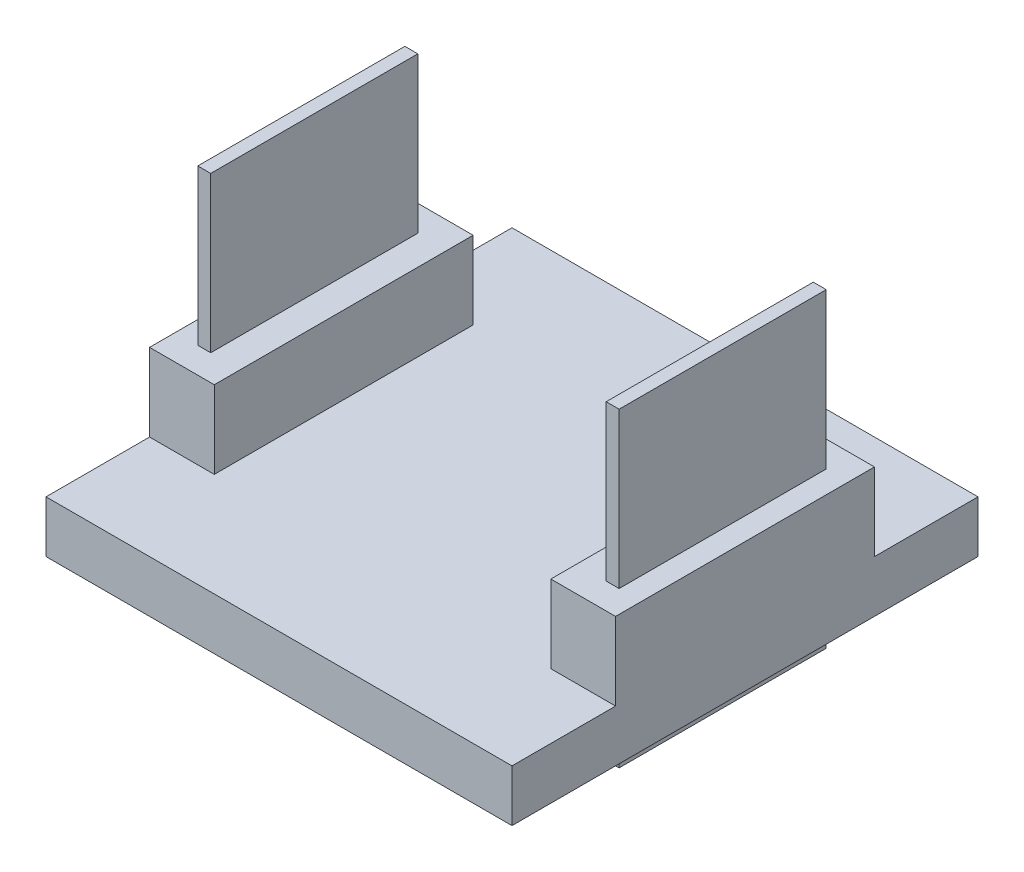
ISO-10303-21;
HEADER;
FILE_DESCRIPTION(('STEP AP214'),'2;1');
FILE_NAME('part.step','',(''),(''),'','','');
FILE_SCHEMA(('AUTOMOTIVE_DESIGN { 1 0 10303 214 1 1 1 1 }'));
ENDSEC;
DATA;
#1=APPLICATION_CONTEXT('core data for automotive mechanical design processes');
#2=APPLICATION_PROTOCOL_DEFINITION('international standard','automotive_design',2000,#1);
#3=PRODUCT_CONTEXT('',#1,'mechanical');
#4=PRODUCT('Part','Part','',(#3));
#5=PRODUCT_RELATED_PRODUCT_CATEGORY('part','',(#4));
#6=PRODUCT_DEFINITION_FORMATION('','',#4);
#7=PRODUCT_DEFINITION_CONTEXT('part definition',#1,'design');
#8=PRODUCT_DEFINITION('design','',#6,#7);
#9=PRODUCT_DEFINITION_SHAPE('','',#8);
#10=(LENGTH_UNIT() NAMED_UNIT(*) SI_UNIT(.MILLI.,.METRE.));
#11=(NAMED_UNIT(*) PLANE_ANGLE_UNIT() SI_UNIT($,.RADIAN.));
#12=(NAMED_UNIT(*) SI_UNIT($,.STERADIAN.) SOLID_ANGLE_UNIT());
#13=UNCERTAINTY_MEASURE_WITH_UNIT(LENGTH_MEASURE(1.E-05),#10,'distance_accuracy_value','');
#14=(GEOMETRIC_REPRESENTATION_CONTEXT(3) GLOBAL_UNCERTAINTY_ASSIGNED_CONTEXT((#13)) GLOBAL_UNIT_ASSIGNED_CONTEXT((#10,
#11,#12)) REPRESENTATION_CONTEXT('',''));
#15=CARTESIAN_POINT('',(0.,0.,0.));
#16=DIRECTION('',(0.,0.,1.));
#17=DIRECTION('',(1.,0.,0.));
#18=AXIS2_PLACEMENT_3D('',#15,#16,#17);
#19=CARTESIAN_POINT('',(0.,2.,0.));
#20=DIRECTION('',(0.,-1.,0.));
#21=DIRECTION('',(0.,0.,-1.));
#22=AXIS2_PLACEMENT_3D('',#19,#20,#21);
#23=PLANE('',#22);
#24=DIRECTION('',(-1.,0.,0.));
#25=VECTOR('',#24,1.);
#26=CARTESIAN_POINT('',(9.,2.,-4.99999999999999));
#27=LINE('',#26,#25);
#28=CARTESIAN_POINT('',(9.,2.,-4.99999999999999));
#29=VERTEX_POINT('',#28);
#30=CARTESIAN_POINT('',(6.5,2.,-5.));
#31=VERTEX_POINT('',#30);
#32=EDGE_CURVE('E327',#29,#31,#27,.T.);
#33=ORIENTED_EDGE('',*,*,#32,.F.);
#34=DIRECTION('',(0.,0.,-1.));
#35=VECTOR('',#34,1.);
#36=CARTESIAN_POINT('',(9.,2.,9.));
#37=LINE('',#36,#35);
#38=CARTESIAN_POINT('',(9.,2.,-9.));
#39=VERTEX_POINT('',#38);
#40=EDGE_CURVE('E391',#29,#39,#37,.T.);
#41=ORIENTED_EDGE('',*,*,#40,.T.);
#42=DIRECTION('',(-1.,0.,0.));
#43=VECTOR('',#42,1.);
#44=CARTESIAN_POINT('',(-9.,2.,-9.));
#45=LINE('',#44,#43);
#46=CARTESIAN_POINT('',(-9.,2.,-9.));
#47=VERTEX_POINT('',#46);
#48=EDGE_CURVE('E390',#39,#47,#45,.T.);
#49=ORIENTED_EDGE('',*,*,#48,.T.);
#50=DIRECTION('',(0.,0.,1.));
#51=VECTOR('',#50,1.);
#52=CARTESIAN_POINT('',(-9.,2.,9.));
#53=LINE('',#52,#51);
#54=CARTESIAN_POINT('',(-9.,2.,-5.));
#55=VERTEX_POINT('',#54);
#56=EDGE_CURVE('E394',#47,#55,#53,.T.);
#57=ORIENTED_EDGE('',*,*,#56,.T.);
#58=DIRECTION('',(-1.,0.,0.));
#59=VECTOR('',#58,1.);
#60=CARTESIAN_POINT('',(-9.,2.,-4.99999999999999));
#61=LINE('',#60,#59);
#62=CARTESIAN_POINT('',(-6.5,2.,-5.));
#63=VERTEX_POINT('',#62);
#64=EDGE_CURVE('E362',#63,#55,#61,.T.);
#65=ORIENTED_EDGE('',*,*,#64,.F.);
#66=DIRECTION('',(0.,0.,-1.));
#67=VECTOR('',#66,1.);
#68=CARTESIAN_POINT('',(-6.5,2.,5.));
#69=LINE('',#68,#67);
#70=CARTESIAN_POINT('',(-6.5,2.,5.));
#71=VERTEX_POINT('',#70);
#72=EDGE_CURVE('E371',#71,#63,#69,.T.);
#73=ORIENTED_EDGE('',*,*,#72,.F.);
#74=DIRECTION('',(1.,0.,0.));
#75=VECTOR('',#74,1.);
#76=CARTESIAN_POINT('',(-9.,2.,5.));
#77=LINE('',#76,#75);
#78=CARTESIAN_POINT('',(-9.,2.,5.));
#79=VERTEX_POINT('',#78);
#80=EDGE_CURVE('E357',#79,#71,#77,.T.);
#81=ORIENTED_EDGE('',*,*,#80,.F.);
#82=CARTESIAN_POINT('',(-9.,2.,9.));
#83=VERTEX_POINT('',#82);
#84=EDGE_CURVE('E393',#79,#83,#53,.T.);
#85=ORIENTED_EDGE('',*,*,#84,.T.);
#86=DIRECTION('',(1.,0.,0.));
#87=VECTOR('',#86,1.);
#88=CARTESIAN_POINT('',(-9.,2.,9.));
#89=LINE('',#88,#87);
#90=CARTESIAN_POINT('',(9.,2.,9.));
#91=VERTEX_POINT('',#90);
#92=EDGE_CURVE('E396',#83,#91,#89,.T.);
#93=ORIENTED_EDGE('',*,*,#92,.T.);
#94=CARTESIAN_POINT('',(9.,2.,5.));
#95=VERTEX_POINT('',#94);
#96=EDGE_CURVE('E388',#91,#95,#37,.T.);
#97=ORIENTED_EDGE('',*,*,#96,.T.);
#98=DIRECTION('',(1.,0.,0.));
#99=VECTOR('',#98,1.);
#100=CARTESIAN_POINT('',(9.,2.,5.));
#101=LINE('',#100,#99);
#102=CARTESIAN_POINT('',(6.5,2.,5.));
#103=VERTEX_POINT('',#102);
#104=EDGE_CURVE('E332',#103,#95,#101,.T.);
#105=ORIENTED_EDGE('',*,*,#104,.F.);
#106=DIRECTION('',(0.,0.,1.));
#107=VECTOR('',#106,1.);
#108=CARTESIAN_POINT('',(6.5,2.,5.));
#109=LINE('',#108,#107);
#110=EDGE_CURVE('E341',#31,#103,#109,.T.);
#111=ORIENTED_EDGE('',*,*,#110,.F.);
#112=EDGE_LOOP('',(#33,#41,#49,#57,#65,#73,#81,#85,#93,#97,#105,#111));
#113=FACE_BOUND('',#112,.T.);
#114=ADVANCED_FACE('F33',(#113),#23,.F.);
#115=CARTESIAN_POINT('',(9.,2.,9.));
#116=DIRECTION('',(-1.,0.,0.));
#117=DIRECTION('',(0.,0.,1.));
#118=AXIS2_PLACEMENT_3D('',#115,#116,#117);
#119=PLANE('',#118);
#120=DIRECTION('',(0.,0.,-1.));
#121=VECTOR('',#120,1.);
#122=CARTESIAN_POINT('',(9.,0.,9.));
#123=LINE('',#122,#121);
#124=CARTESIAN_POINT('',(9.,0.,9.));
#125=VERTEX_POINT('',#124);
#126=CARTESIAN_POINT('',(9.,0.,-9.));
#127=VERTEX_POINT('',#126);
#128=EDGE_CURVE('E387',#125,#127,#123,.T.);
#129=ORIENTED_EDGE('',*,*,#128,.T.);
#130=DIRECTION('',(0.,-1.,0.));
#131=VECTOR('',#130,1.);
#132=CARTESIAN_POINT('',(9.,2.,-9.));
#133=LINE('',#132,#131);
#134=EDGE_CURVE('E415',#39,#127,#133,.T.);
#135=ORIENTED_EDGE('',*,*,#134,.F.);
#136=ORIENTED_EDGE('',*,*,#40,.F.);
#137=DIRECTION('',(0.,-1.,0.));
#138=VECTOR('',#137,1.);
#139=CARTESIAN_POINT('',(9.,5.,-4.99999999999999));
#140=LINE('',#139,#138);
#141=CARTESIAN_POINT('',(9.,5.,-4.99999999999999));
#142=VERTEX_POINT('',#141);
#143=EDGE_CURVE('E354',#142,#29,#140,.T.);
#144=ORIENTED_EDGE('',*,*,#143,.F.);
#145=DIRECTION('',(0.,0.,-1.));
#146=VECTOR('',#145,1.);
#147=CARTESIAN_POINT('',(9.,5.,5.));
#148=LINE('',#147,#146);
#149=CARTESIAN_POINT('',(9.,5.,5.));
#150=VERTEX_POINT('',#149);
#151=EDGE_CURVE('E328',#150,#142,#148,.T.);
#152=ORIENTED_EDGE('',*,*,#151,.F.);
#153=DIRECTION('',(0.,-1.,0.));
#154=VECTOR('',#153,1.);
#155=CARTESIAN_POINT('',(9.,5.,5.));
#156=LINE('',#155,#154);
#157=EDGE_CURVE('E338',#150,#95,#156,.T.);
#158=ORIENTED_EDGE('',*,*,#157,.T.);
#159=ORIENTED_EDGE('',*,*,#96,.F.);
#160=DIRECTION('',(0.,-1.,0.));
#161=VECTOR('',#160,1.);
#162=CARTESIAN_POINT('',(9.,2.,9.));
#163=LINE('',#162,#161);
#164=EDGE_CURVE('E398',#91,#125,#163,.T.);
#165=ORIENTED_EDGE('',*,*,#164,.T.);
#166=EDGE_LOOP('',(#129,#135,#136,#144,#152,#158,#159,#165));
#167=FACE_BOUND('',#166,.T.);
#168=ADVANCED_FACE('F35',(#167),#119,.F.);
#169=CARTESIAN_POINT('',(-9.,2.,-9.));
#170=DIRECTION('',(0.,0.,1.));
#171=DIRECTION('',(1.,0.,0.));
#172=AXIS2_PLACEMENT_3D('',#169,#170,#171);
#173=PLANE('',#172);
#174=DIRECTION('',(-1.,0.,0.));
#175=VECTOR('',#174,1.);
#176=CARTESIAN_POINT('',(-9.,0.,-9.));
#177=LINE('',#176,#175);
#178=CARTESIAN_POINT('',(-9.,0.,-9.));
#179=VERTEX_POINT('',#178);
#180=EDGE_CURVE('E401',#127,#179,#177,.T.);
#181=ORIENTED_EDGE('',*,*,#180,.T.);
#182=DIRECTION('',(0.,-1.,0.));
#183=VECTOR('',#182,1.);
#184=CARTESIAN_POINT('',(-9.,2.,-9.));
#185=LINE('',#184,#183);
#186=EDGE_CURVE('E412',#47,#179,#185,.T.);
#187=ORIENTED_EDGE('',*,*,#186,.F.);
#188=ORIENTED_EDGE('',*,*,#48,.F.);
#189=ORIENTED_EDGE('',*,*,#134,.T.);
#190=EDGE_LOOP('',(#181,#187,#188,#189));
#191=FACE_BOUND('',#190,.T.);
#192=ADVANCED_FACE('F462',(#191),#173,.F.);
#193=CARTESIAN_POINT('',(-9.,2.,9.));
#194=DIRECTION('',(1.,0.,0.));
#195=DIRECTION('',(0.,0.,-1.));
#196=AXIS2_PLACEMENT_3D('',#193,#194,#195);
#197=PLANE('',#196);
#198=DIRECTION('',(0.,0.,1.));
#199=VECTOR('',#198,1.);
#200=CARTESIAN_POINT('',(-9.,0.,9.));
#201=LINE('',#200,#199);
#202=CARTESIAN_POINT('',(-9.,0.,9.));
#203=VERTEX_POINT('',#202);
#204=EDGE_CURVE('E403',#179,#203,#201,.T.);
#205=ORIENTED_EDGE('',*,*,#204,.T.);
#206=DIRECTION('',(0.,-1.,0.));
#207=VECTOR('',#206,1.);
#208=CARTESIAN_POINT('',(-9.,2.,9.));
#209=LINE('',#208,#207);
#210=EDGE_CURVE('E409',#83,#203,#209,.T.);
#211=ORIENTED_EDGE('',*,*,#210,.F.);
#212=ORIENTED_EDGE('',*,*,#84,.F.);
#213=DIRECTION('',(0.,-1.,0.));
#214=VECTOR('',#213,1.);
#215=CARTESIAN_POINT('',(-9.,5.,5.));
#216=LINE('',#215,#214);
#217=CARTESIAN_POINT('',(-9.,5.,5.));
#218=VERTEX_POINT('',#217);
#219=EDGE_CURVE('E384',#218,#79,#216,.T.);
#220=ORIENTED_EDGE('',*,*,#219,.F.);
#221=DIRECTION('',(0.,0.,1.));
#222=VECTOR('',#221,1.);
#223=CARTESIAN_POINT('',(-9.,5.,5.));
#224=LINE('',#223,#222);
#225=CARTESIAN_POINT('',(-9.,5.,-4.99999999999999));
#226=VERTEX_POINT('',#225);
#227=EDGE_CURVE('E358',#226,#218,#224,.T.);
#228=ORIENTED_EDGE('',*,*,#227,.F.);
#229=DIRECTION('',(0.,-1.,0.));
#230=VECTOR('',#229,1.);
#231=CARTESIAN_POINT('',(-9.,5.,-4.99999999999999));
#232=LINE('',#231,#230);
#233=EDGE_CURVE('E368',#226,#55,#232,.T.);
#234=ORIENTED_EDGE('',*,*,#233,.T.);
#235=ORIENTED_EDGE('',*,*,#56,.F.);
#236=ORIENTED_EDGE('',*,*,#186,.T.);
#237=EDGE_LOOP('',(#205,#211,#212,#220,#228,#234,#235,#236));
#238=FACE_BOUND('',#237,.T.);
#239=ADVANCED_FACE('F475',(#238),#197,.F.);
#240=CARTESIAN_POINT('',(-9.,2.,9.));
#241=DIRECTION('',(0.,0.,-1.));
#242=DIRECTION('',(-1.,0.,0.));
#243=AXIS2_PLACEMENT_3D('',#240,#241,#242);
#244=PLANE('',#243);
#245=DIRECTION('',(1.,0.,0.));
#246=VECTOR('',#245,1.);
#247=CARTESIAN_POINT('',(-9.,0.,9.));
#248=LINE('',#247,#246);
#249=EDGE_CURVE('E405',#203,#125,#248,.T.);
#250=ORIENTED_EDGE('',*,*,#249,.T.);
#251=ORIENTED_EDGE('',*,*,#164,.F.);
#252=ORIENTED_EDGE('',*,*,#92,.F.);
#253=ORIENTED_EDGE('',*,*,#210,.T.);
#254=EDGE_LOOP('',(#250,#251,#252,#253));
#255=FACE_BOUND('',#254,.T.);
#256=ADVANCED_FACE('F472',(#255),#244,.F.);
#257=CARTESIAN_POINT('',(0.,0.,0.));
#258=DIRECTION('',(0.,-1.,0.));
#259=DIRECTION('',(0.,0.,-1.));
#260=AXIS2_PLACEMENT_3D('',#257,#258,#259);
#261=PLANE('',#260);
#262=DIRECTION('',(0.,0.,1.));
#263=VECTOR('',#262,1.);
#264=CARTESIAN_POINT('',(8.13755561268732,0.,0.));
#265=LINE('',#264,#263);
#266=CARTESIAN_POINT('',(8.13755561268732,0.,-3.99999999999999));
#267=VERTEX_POINT('',#266);
#268=CARTESIAN_POINT('',(8.13755561268732,0.,4.00000000000001));
#269=VERTEX_POINT('',#268);
#270=EDGE_CURVE('E273',#267,#269,#265,.T.);
#271=ORIENTED_EDGE('',*,*,#270,.F.);
#272=DIRECTION('',(1.,0.,0.));
#273=VECTOR('',#272,1.);
#274=CARTESIAN_POINT('',(0.,0.,-3.99999999999999));
#275=LINE('',#274,#273);
#276=CARTESIAN_POINT('',(7.63755561268732,0.,-3.99999999999999));
#277=VERTEX_POINT('',#276);
#278=EDGE_CURVE('E259',#277,#267,#275,.T.);
#279=ORIENTED_EDGE('',*,*,#278,.F.);
#280=DIRECTION('',(0.,0.,-1.));
#281=VECTOR('',#280,1.);
#282=CARTESIAN_POINT('',(7.63755561268732,0.,0.));
#283=LINE('',#282,#281);
#284=CARTESIAN_POINT('',(7.63755561268732,0.,4.00000000000001));
#285=VERTEX_POINT('',#284);
#286=EDGE_CURVE('E53',#285,#277,#283,.T.);
#287=ORIENTED_EDGE('',*,*,#286,.F.);
#288=DIRECTION('',(-1.,0.,0.));
#289=VECTOR('',#288,1.);
#290=CARTESIAN_POINT('',(0.,0.,4.00000000000001));
#291=LINE('',#290,#289);
#292=EDGE_CURVE('E48',#269,#285,#291,.T.);
#293=ORIENTED_EDGE('',*,*,#292,.F.);
#294=EDGE_LOOP('',(#271,#279,#287,#293));
#295=FACE_BOUND('',#294,.T.);
#296=DIRECTION('',(0.,0.,1.));
#297=VECTOR('',#296,1.);
#298=CARTESIAN_POINT('',(-7.63755561268731,0.,0.));
#299=LINE('',#298,#297);
#300=CARTESIAN_POINT('',(-7.63755561268731,0.,-3.99999999999999));
#301=VERTEX_POINT('',#300);
#302=CARTESIAN_POINT('',(-7.63755561268731,0.,4.00000000000001));
#303=VERTEX_POINT('',#302);
#304=EDGE_CURVE('E324',#301,#303,#299,.T.);
#305=ORIENTED_EDGE('',*,*,#304,.F.);
#306=DIRECTION('',(1.,0.,0.));
#307=VECTOR('',#306,1.);
#308=CARTESIAN_POINT('',(0.,0.,-3.99999999999999));
#309=LINE('',#308,#307);
#310=CARTESIAN_POINT('',(-8.13755561268731,0.,-3.99999999999999));
#311=VERTEX_POINT('',#310);
#312=EDGE_CURVE('E303',#311,#301,#309,.T.);
#313=ORIENTED_EDGE('',*,*,#312,.F.);
#314=DIRECTION('',(0.,0.,-1.));
#315=VECTOR('',#314,1.);
#316=CARTESIAN_POINT('',(-8.13755561268731,0.,0.));
#317=LINE('',#316,#315);
#318=CARTESIAN_POINT('',(-8.13755561268731,0.,4.00000000000001));
#319=VERTEX_POINT('',#318);
#320=EDGE_CURVE('E318',#319,#311,#317,.T.);
#321=ORIENTED_EDGE('',*,*,#320,.F.);
#322=DIRECTION('',(-1.,0.,0.));
#323=VECTOR('',#322,1.);
#324=CARTESIAN_POINT('',(0.,0.,4.00000000000001));
#325=LINE('',#324,#323);
#326=EDGE_CURVE('E321',#303,#319,#325,.T.);
#327=ORIENTED_EDGE('',*,*,#326,.F.);
#328=EDGE_LOOP('',(#305,#313,#321,#327));
#329=FACE_BOUND('',#328,.T.);
#330=ORIENTED_EDGE('',*,*,#128,.F.);
#331=ORIENTED_EDGE('',*,*,#249,.F.);
#332=ORIENTED_EDGE('',*,*,#204,.F.);
#333=ORIENTED_EDGE('',*,*,#180,.F.);
#334=EDGE_LOOP('',(#330,#331,#332,#333));
#335=FACE_BOUND('',#334,.T.);
#336=ADVANCED_FACE('F469',(#295,#329,#335),#261,.T.);
#337=CARTESIAN_POINT('',(-9.,5.,5.));
#338=DIRECTION('',(0.,0.,-1.));
#339=DIRECTION('',(-1.,0.,0.));
#340=AXIS2_PLACEMENT_3D('',#337,#338,#339);
#341=PLANE('',#340);
#342=ORIENTED_EDGE('',*,*,#80,.T.);
#343=DIRECTION('',(0.,-1.,0.));
#344=VECTOR('',#343,1.);
#345=CARTESIAN_POINT('',(-6.5,5.,5.));
#346=LINE('',#345,#344);
#347=CARTESIAN_POINT('',(-6.5,5.,5.));
#348=VERTEX_POINT('',#347);
#349=EDGE_CURVE('E381',#348,#71,#346,.T.);
#350=ORIENTED_EDGE('',*,*,#349,.F.);
#351=DIRECTION('',(1.,0.,0.));
#352=VECTOR('',#351,1.);
#353=CARTESIAN_POINT('',(-9.,5.,5.));
#354=LINE('',#353,#352);
#355=EDGE_CURVE('E361',#218,#348,#354,.T.);
#356=ORIENTED_EDGE('',*,*,#355,.F.);
#357=ORIENTED_EDGE('',*,*,#219,.T.);
#358=EDGE_LOOP('',(#342,#350,#356,#357));
#359=FACE_BOUND('',#358,.T.);
#360=ADVANCED_FACE('F467',(#359),#341,.F.);
#361=CARTESIAN_POINT('',(-6.5,5.,5.));
#362=DIRECTION('',(-1.,0.,0.));
#363=DIRECTION('',(0.,0.,1.));
#364=AXIS2_PLACEMENT_3D('',#361,#362,#363);
#365=PLANE('',#364);
#366=ORIENTED_EDGE('',*,*,#72,.T.);
#367=DIRECTION('',(0.,-1.,0.));
#368=VECTOR('',#367,1.);
#369=CARTESIAN_POINT('',(-6.5,5.,-5.));
#370=LINE('',#369,#368);
#371=CARTESIAN_POINT('',(-6.5,5.,-5.));
#372=VERTEX_POINT('',#371);
#373=EDGE_CURVE('E378',#372,#63,#370,.T.);
#374=ORIENTED_EDGE('',*,*,#373,.F.);
#375=DIRECTION('',(0.,0.,-1.));
#376=VECTOR('',#375,1.);
#377=CARTESIAN_POINT('',(-6.5,5.,5.));
#378=LINE('',#377,#376);
#379=EDGE_CURVE('E364',#348,#372,#378,.T.);
#380=ORIENTED_EDGE('',*,*,#379,.F.);
#381=ORIENTED_EDGE('',*,*,#349,.T.);
#382=EDGE_LOOP('',(#366,#374,#380,#381));
#383=FACE_BOUND('',#382,.T.);
#384=ADVANCED_FACE('F521',(#383),#365,.F.);
#385=CARTESIAN_POINT('',(-9.,5.,-4.99999999999999));
#386=DIRECTION('',(0.,0.,1.));
#387=DIRECTION('',(1.,0.,0.));
#388=AXIS2_PLACEMENT_3D('',#385,#386,#387);
#389=PLANE('',#388);
#390=ORIENTED_EDGE('',*,*,#64,.T.);
#391=ORIENTED_EDGE('',*,*,#233,.F.);
#392=DIRECTION('',(-1.,0.,0.));
#393=VECTOR('',#392,1.);
#394=CARTESIAN_POINT('',(-9.,5.,-4.99999999999999));
#395=LINE('',#394,#393);
#396=EDGE_CURVE('E366',#372,#226,#395,.T.);
#397=ORIENTED_EDGE('',*,*,#396,.F.);
#398=ORIENTED_EDGE('',*,*,#373,.T.);
#399=EDGE_LOOP('',(#390,#391,#397,#398));
#400=FACE_BOUND('',#399,.T.);
#401=ADVANCED_FACE('F510',(#400),#389,.F.);
#402=CARTESIAN_POINT('',(0.,5.,0.));
#403=DIRECTION('',(0.,-1.,0.));
#404=DIRECTION('',(0.,0.,-1.));
#405=AXIS2_PLACEMENT_3D('',#402,#403,#404);
#406=PLANE('',#405);
#407=DIRECTION('',(1.,0.,0.));
#408=VECTOR('',#407,1.);
#409=CARTESIAN_POINT('',(0.,5.,-3.99999999999999));
#410=LINE('',#409,#408);
#411=CARTESIAN_POINT('',(-8.13755561268731,5.,-3.99999999999999));
#412=VERTEX_POINT('',#411);
#413=CARTESIAN_POINT('',(-7.63755561268731,5.,-3.99999999999999));
#414=VERTEX_POINT('',#413);
#415=EDGE_CURVE('E418',#412,#414,#410,.T.);
#416=ORIENTED_EDGE('',*,*,#415,.T.);
#417=DIRECTION('',(0.,0.,1.));
#418=VECTOR('',#417,1.);
#419=CARTESIAN_POINT('',(-7.63755561268731,5.,0.));
#420=LINE('',#419,#418);
#421=CARTESIAN_POINT('',(-7.63755561268731,5.,4.00000000000001));
#422=VERTEX_POINT('',#421);
#423=EDGE_CURVE('E427',#414,#422,#420,.T.);
#424=ORIENTED_EDGE('',*,*,#423,.T.);
#425=DIRECTION('',(-1.,0.,0.));
#426=VECTOR('',#425,1.);
#427=CARTESIAN_POINT('',(0.,5.,4.00000000000001));
#428=LINE('',#427,#426);
#429=CARTESIAN_POINT('',(-8.13755561268731,5.,4.00000000000001));
#430=VERTEX_POINT('',#429);
#431=EDGE_CURVE('E424',#422,#430,#428,.T.);
#432=ORIENTED_EDGE('',*,*,#431,.T.);
#433=DIRECTION('',(0.,0.,-1.));
#434=VECTOR('',#433,1.);
#435=CARTESIAN_POINT('',(-8.13755561268731,5.,0.));
#436=LINE('',#435,#434);
#437=EDGE_CURVE('E421',#430,#412,#436,.T.);
#438=ORIENTED_EDGE('',*,*,#437,.T.);
#439=EDGE_LOOP('',(#416,#424,#432,#438));
#440=FACE_BOUND('',#439,.T.);
#441=ORIENTED_EDGE('',*,*,#227,.T.);
#442=ORIENTED_EDGE('',*,*,#355,.T.);
#443=ORIENTED_EDGE('',*,*,#379,.T.);
#444=ORIENTED_EDGE('',*,*,#396,.T.);
#445=EDGE_LOOP('',(#441,#442,#443,#444));
#446=FACE_BOUND('',#445,.T.);
#447=ADVANCED_FACE('F517',(#440,#446),#406,.F.);
#448=CARTESIAN_POINT('',(9.,5.,-4.99999999999999));
#449=DIRECTION('',(0.,0.,1.));
#450=DIRECTION('',(1.,0.,0.));
#451=AXIS2_PLACEMENT_3D('',#448,#449,#450);
#452=PLANE('',#451);
#453=ORIENTED_EDGE('',*,*,#32,.T.);
#454=DIRECTION('',(0.,-1.,0.));
#455=VECTOR('',#454,1.);
#456=CARTESIAN_POINT('',(6.5,5.,-5.));
#457=LINE('',#456,#455);
#458=CARTESIAN_POINT('',(6.5,5.,-5.));
#459=VERTEX_POINT('',#458);
#460=EDGE_CURVE('E351',#459,#31,#457,.T.);
#461=ORIENTED_EDGE('',*,*,#460,.F.);
#462=DIRECTION('',(-1.,0.,0.));
#463=VECTOR('',#462,1.);
#464=CARTESIAN_POINT('',(9.,5.,-4.99999999999999));
#465=LINE('',#464,#463);
#466=EDGE_CURVE('E331',#142,#459,#465,.T.);
#467=ORIENTED_EDGE('',*,*,#466,.F.);
#468=ORIENTED_EDGE('',*,*,#143,.T.);
#469=EDGE_LOOP('',(#453,#461,#467,#468));
#470=FACE_BOUND('',#469,.T.);
#471=ADVANCED_FACE('F506',(#470),#452,.F.);
#472=CARTESIAN_POINT('',(6.5,5.,5.));
#473=DIRECTION('',(1.,0.,0.));
#474=DIRECTION('',(0.,0.,-1.));
#475=AXIS2_PLACEMENT_3D('',#472,#473,#474);
#476=PLANE('',#475);
#477=ORIENTED_EDGE('',*,*,#110,.T.);
#478=DIRECTION('',(0.,-1.,0.));
#479=VECTOR('',#478,1.);
#480=CARTESIAN_POINT('',(6.5,5.,5.));
#481=LINE('',#480,#479);
#482=CARTESIAN_POINT('',(6.5,5.,5.));
#483=VERTEX_POINT('',#482);
#484=EDGE_CURVE('E348',#483,#103,#481,.T.);
#485=ORIENTED_EDGE('',*,*,#484,.F.);
#486=DIRECTION('',(0.,0.,1.));
#487=VECTOR('',#486,1.);
#488=CARTESIAN_POINT('',(6.5,5.,5.));
#489=LINE('',#488,#487);
#490=EDGE_CURVE('E334',#459,#483,#489,.T.);
#491=ORIENTED_EDGE('',*,*,#490,.F.);
#492=ORIENTED_EDGE('',*,*,#460,.T.);
#493=EDGE_LOOP('',(#477,#485,#491,#492));
#494=FACE_BOUND('',#493,.T.);
#495=ADVANCED_FACE('F503',(#494),#476,.F.);
#496=CARTESIAN_POINT('',(9.,5.,5.));
#497=DIRECTION('',(0.,0.,-1.));
#498=DIRECTION('',(-1.,0.,0.));
#499=AXIS2_PLACEMENT_3D('',#496,#497,#498);
#500=PLANE('',#499);
#501=ORIENTED_EDGE('',*,*,#104,.T.);
#502=ORIENTED_EDGE('',*,*,#157,.F.);
#503=DIRECTION('',(1.,0.,0.));
#504=VECTOR('',#503,1.);
#505=CARTESIAN_POINT('',(9.,5.,5.));
#506=LINE('',#505,#504);
#507=EDGE_CURVE('E336',#483,#150,#506,.T.);
#508=ORIENTED_EDGE('',*,*,#507,.F.);
#509=ORIENTED_EDGE('',*,*,#484,.T.);
#510=EDGE_LOOP('',(#501,#502,#508,#509));
#511=FACE_BOUND('',#510,.T.);
#512=ADVANCED_FACE('F498',(#511),#500,.F.);
#513=CARTESIAN_POINT('',(0.,5.,0.));
#514=DIRECTION('',(0.,1.,0.));
#515=DIRECTION('',(0.,0.,1.));
#516=AXIS2_PLACEMENT_3D('',#513,#514,#515);
#517=PLANE('',#516);
#518=DIRECTION('',(0.,0.,-1.));
#519=VECTOR('',#518,1.);
#520=CARTESIAN_POINT('',(8.13755561268732,5.,0.));
#521=LINE('',#520,#519);
#522=CARTESIAN_POINT('',(8.13755561268732,5.,4.00000000000001));
#523=VERTEX_POINT('',#522);
#524=CARTESIAN_POINT('',(8.13755561268732,5.,-3.99999999999999));
#525=VERTEX_POINT('',#524);
#526=EDGE_CURVE('E11',#523,#525,#521,.T.);
#527=ORIENTED_EDGE('',*,*,#526,.F.);
#528=DIRECTION('',(1.,0.,0.));
#529=VECTOR('',#528,1.);
#530=CARTESIAN_POINT('',(0.,5.,4.00000000000001));
#531=LINE('',#530,#529);
#532=CARTESIAN_POINT('',(7.63755561268732,5.,4.00000000000001));
#533=VERTEX_POINT('',#532);
#534=EDGE_CURVE('E41',#533,#523,#531,.T.);
#535=ORIENTED_EDGE('',*,*,#534,.F.);
#536=DIRECTION('',(0.,0.,1.));
#537=VECTOR('',#536,1.);
#538=CARTESIAN_POINT('',(7.63755561268732,5.,0.));
#539=LINE('',#538,#537);
#540=CARTESIAN_POINT('',(7.63755561268732,5.,-3.99999999999999));
#541=VERTEX_POINT('',#540);
#542=EDGE_CURVE('E432',#541,#533,#539,.T.);
#543=ORIENTED_EDGE('',*,*,#542,.F.);
#544=DIRECTION('',(-1.,0.,0.));
#545=VECTOR('',#544,1.);
#546=CARTESIAN_POINT('',(0.,5.,-3.99999999999999));
#547=LINE('',#546,#545);
#548=EDGE_CURVE('E430',#525,#541,#547,.T.);
#549=ORIENTED_EDGE('',*,*,#548,.F.);
#550=EDGE_LOOP('',(#527,#535,#543,#549));
#551=FACE_BOUND('',#550,.T.);
#552=ORIENTED_EDGE('',*,*,#151,.T.);
#553=ORIENTED_EDGE('',*,*,#466,.T.);
#554=ORIENTED_EDGE('',*,*,#490,.T.);
#555=ORIENTED_EDGE('',*,*,#507,.T.);
#556=EDGE_LOOP('',(#552,#553,#554,#555));
#557=FACE_BOUND('',#556,.T.);
#558=ADVANCED_FACE('F439',(#551,#557),#517,.T.);
#559=CARTESIAN_POINT('',(0.,11.,0.));
#560=DIRECTION('',(0.,-1.,0.));
#561=DIRECTION('',(0.,0.,-1.));
#562=AXIS2_PLACEMENT_3D('',#559,#560,#561);
#563=PLANE('',#562);
#564=DIRECTION('',(0.,0.,-1.));
#565=VECTOR('',#564,1.);
#566=CARTESIAN_POINT('',(-7.63755561268731,11.,4.00000000000001));
#567=LINE('',#566,#565);
#568=CARTESIAN_POINT('',(-7.63755561268731,11.,4.00000000000001));
#569=VERTEX_POINT('',#568);
#570=CARTESIAN_POINT('',(-7.63755561268731,11.,-3.99999999999999));
#571=VERTEX_POINT('',#570);
#572=EDGE_CURVE('E275',#569,#571,#567,.T.);
#573=ORIENTED_EDGE('',*,*,#572,.T.);
#574=DIRECTION('',(-1.,0.,0.));
#575=VECTOR('',#574,1.);
#576=CARTESIAN_POINT('',(-8.13755561268731,11.,-3.99999999999999));
#577=LINE('',#576,#575);
#578=CARTESIAN_POINT('',(-8.13755561268731,11.,-3.99999999999999));
#579=VERTEX_POINT('',#578);
#580=EDGE_CURVE('E278',#571,#579,#577,.T.);
#581=ORIENTED_EDGE('',*,*,#580,.T.);
#582=DIRECTION('',(0.,0.,1.));
#583=VECTOR('',#582,1.);
#584=CARTESIAN_POINT('',(-8.13755561268731,11.,4.00000000000001));
#585=LINE('',#584,#583);
#586=CARTESIAN_POINT('',(-8.13755561268731,11.,4.00000000000001));
#587=VERTEX_POINT('',#586);
#588=EDGE_CURVE('E281',#579,#587,#585,.T.);
#589=ORIENTED_EDGE('',*,*,#588,.T.);
#590=DIRECTION('',(1.,0.,0.));
#591=VECTOR('',#590,1.);
#592=CARTESIAN_POINT('',(-8.13755561268731,11.,4.00000000000001));
#593=LINE('',#592,#591);
#594=EDGE_CURVE('E284',#587,#569,#593,.T.);
#595=ORIENTED_EDGE('',*,*,#594,.T.);
#596=EDGE_LOOP('',(#573,#581,#589,#595));
#597=FACE_BOUND('',#596,.T.);
#598=ADVANCED_FACE('F543',(#597),#563,.F.);
#599=CARTESIAN_POINT('',(-8.13755561268731,-1.,-3.99999999999999));
#600=DIRECTION('',(0.,0.,-1.));
#601=DIRECTION('',(-1.,0.,0.));
#602=AXIS2_PLACEMENT_3D('',#599,#600,#601);
#603=PLANE('',#602);
#604=ORIENTED_EDGE('',*,*,#415,.F.);
#605=DIRECTION('',(0.,1.,0.));
#606=VECTOR('',#605,1.);
#607=CARTESIAN_POINT('',(-8.13755561268731,-1.,-3.99999999999999));
#608=LINE('',#607,#606);
#609=EDGE_CURVE('E312',#412,#579,#608,.T.);
#610=ORIENTED_EDGE('',*,*,#609,.T.);
#611=ORIENTED_EDGE('',*,*,#580,.F.);
#612=DIRECTION('',(0.,1.,0.));
#613=VECTOR('',#612,1.);
#614=CARTESIAN_POINT('',(-7.63755561268731,-1.,-3.99999999999999));
#615=LINE('',#614,#613);
#616=EDGE_CURVE('E299',#414,#571,#615,.T.);
#617=ORIENTED_EDGE('',*,*,#616,.F.);
#618=EDGE_LOOP('',(#604,#610,#611,#617));
#619=FACE_BOUND('',#618,.T.);
#620=ADVANCED_FACE('F556',(#619),#603,.T.);
#621=CARTESIAN_POINT('',(-8.13755561268731,-1.,4.00000000000001));
#622=DIRECTION('',(-1.,0.,0.));
#623=DIRECTION('',(0.,0.,1.));
#624=AXIS2_PLACEMENT_3D('',#621,#622,#623);
#625=PLANE('',#624);
#626=ORIENTED_EDGE('',*,*,#437,.F.);
#627=DIRECTION('',(0.,1.,0.));
#628=VECTOR('',#627,1.);
#629=CARTESIAN_POINT('',(-8.13755561268731,-1.,4.00000000000001));
#630=LINE('',#629,#628);
#631=EDGE_CURVE('E308',#430,#587,#630,.T.);
#632=ORIENTED_EDGE('',*,*,#631,.T.);
#633=ORIENTED_EDGE('',*,*,#588,.F.);
#634=ORIENTED_EDGE('',*,*,#609,.F.);
#635=EDGE_LOOP('',(#626,#632,#633,#634));
#636=FACE_BOUND('',#635,.T.);
#637=ADVANCED_FACE('F560',(#636),#625,.T.);
#638=CARTESIAN_POINT('',(-8.13755561268731,-1.,4.00000000000001));
#639=DIRECTION('',(0.,0.,1.));
#640=DIRECTION('',(1.,0.,0.));
#641=AXIS2_PLACEMENT_3D('',#638,#639,#640);
#642=PLANE('',#641);
#643=ORIENTED_EDGE('',*,*,#431,.F.);
#644=DIRECTION('',(0.,1.,0.));
#645=VECTOR('',#644,1.);
#646=CARTESIAN_POINT('',(-7.63755561268731,-1.,4.00000000000001));
#647=LINE('',#646,#645);
#648=EDGE_CURVE('E304',#422,#569,#647,.T.);
#649=ORIENTED_EDGE('',*,*,#648,.T.);
#650=ORIENTED_EDGE('',*,*,#594,.F.);
#651=ORIENTED_EDGE('',*,*,#631,.F.);
#652=EDGE_LOOP('',(#643,#649,#650,#651));
#653=FACE_BOUND('',#652,.T.);
#654=ADVANCED_FACE('F564',(#653),#642,.T.);
#655=CARTESIAN_POINT('',(-7.63755561268731,-1.,4.00000000000001));
#656=DIRECTION('',(1.,0.,0.));
#657=DIRECTION('',(0.,0.,-1.));
#658=AXIS2_PLACEMENT_3D('',#655,#656,#657);
#659=PLANE('',#658);
#660=ORIENTED_EDGE('',*,*,#423,.F.);
#661=ORIENTED_EDGE('',*,*,#616,.T.);
#662=ORIENTED_EDGE('',*,*,#572,.F.);
#663=ORIENTED_EDGE('',*,*,#648,.F.);
#664=EDGE_LOOP('',(#660,#661,#662,#663));
#665=FACE_BOUND('',#664,.T.);
#666=ADVANCED_FACE('F548',(#665),#659,.T.);
#667=CARTESIAN_POINT('',(-7.63755561268731,-1.,-3.99999999999999));
#668=VERTEX_POINT('',#667);
#669=EDGE_CURVE('E313',#668,#301,#615,.T.);
#670=ORIENTED_EDGE('',*,*,#669,.T.);
#671=ORIENTED_EDGE('',*,*,#304,.T.);
#672=CARTESIAN_POINT('',(-7.63755561268731,-1.,4.00000000000001));
#673=VERTEX_POINT('',#672);
#674=EDGE_CURVE('E300',#673,#303,#647,.T.);
#675=ORIENTED_EDGE('',*,*,#674,.F.);
#676=DIRECTION('',(0.,0.,-1.));
#677=VECTOR('',#676,1.);
#678=CARTESIAN_POINT('',(-7.63755561268731,-1.,4.00000000000001));
#679=LINE('',#678,#677);
#680=EDGE_CURVE('E287',#673,#668,#679,.T.);
#681=ORIENTED_EDGE('',*,*,#680,.T.);
#682=EDGE_LOOP('',(#670,#671,#675,#681));
#683=FACE_BOUND('',#682,.T.);
#684=ADVANCED_FACE('F544',(#683),#659,.T.);
#685=ORIENTED_EDGE('',*,*,#674,.T.);
#686=ORIENTED_EDGE('',*,*,#326,.T.);
#687=CARTESIAN_POINT('',(-8.13755561268731,-1.,4.00000000000001));
#688=VERTEX_POINT('',#687);
#689=EDGE_CURVE('E305',#688,#319,#630,.T.);
#690=ORIENTED_EDGE('',*,*,#689,.F.);
#691=DIRECTION('',(1.,0.,0.));
#692=VECTOR('',#691,1.);
#693=CARTESIAN_POINT('',(-8.13755561268731,-1.,4.00000000000001));
#694=LINE('',#693,#692);
#695=EDGE_CURVE('E296',#688,#673,#694,.T.);
#696=ORIENTED_EDGE('',*,*,#695,.T.);
#697=EDGE_LOOP('',(#685,#686,#690,#696));
#698=FACE_BOUND('',#697,.T.);
#699=ADVANCED_FACE('F547',(#698),#642,.T.);
#700=ORIENTED_EDGE('',*,*,#689,.T.);
#701=ORIENTED_EDGE('',*,*,#320,.T.);
#702=CARTESIAN_POINT('',(-8.13755561268731,-1.,-3.99999999999999));
#703=VERTEX_POINT('',#702);
#704=EDGE_CURVE('E309',#703,#311,#608,.T.);
#705=ORIENTED_EDGE('',*,*,#704,.F.);
#706=DIRECTION('',(0.,0.,1.));
#707=VECTOR('',#706,1.);
#708=CARTESIAN_POINT('',(-8.13755561268731,-1.,4.00000000000001));
#709=LINE('',#708,#707);
#710=EDGE_CURVE('E293',#703,#688,#709,.T.);
#711=ORIENTED_EDGE('',*,*,#710,.T.);
#712=EDGE_LOOP('',(#700,#701,#705,#711));
#713=FACE_BOUND('',#712,.T.);
#714=ADVANCED_FACE('F554',(#713),#625,.T.);
#715=ORIENTED_EDGE('',*,*,#704,.T.);
#716=ORIENTED_EDGE('',*,*,#312,.T.);
#717=ORIENTED_EDGE('',*,*,#669,.F.);
#718=DIRECTION('',(-1.,0.,0.));
#719=VECTOR('',#718,1.);
#720=CARTESIAN_POINT('',(-8.13755561268731,-1.,-3.99999999999999));
#721=LINE('',#720,#719);
#722=EDGE_CURVE('E290',#668,#703,#721,.T.);
#723=ORIENTED_EDGE('',*,*,#722,.T.);
#724=EDGE_LOOP('',(#715,#716,#717,#723));
#725=FACE_BOUND('',#724,.T.);
#726=ADVANCED_FACE('F550',(#725),#603,.T.);
#727=CARTESIAN_POINT('',(0.,-1.,0.));
#728=DIRECTION('',(0.,-1.,0.));
#729=DIRECTION('',(0.,0.,-1.));
#730=AXIS2_PLACEMENT_3D('',#727,#728,#729);
#731=PLANE('',#730);
#732=ORIENTED_EDGE('',*,*,#680,.F.);
#733=ORIENTED_EDGE('',*,*,#695,.F.);
#734=ORIENTED_EDGE('',*,*,#710,.F.);
#735=ORIENTED_EDGE('',*,*,#722,.F.);
#736=EDGE_LOOP('',(#732,#733,#734,#735));
#737=FACE_BOUND('',#736,.T.);
#738=ADVANCED_FACE('F553',(#737),#731,.T.);
#739=CARTESIAN_POINT('',(0.,11.,0.));
#740=DIRECTION('',(0.,1.,0.));
#741=DIRECTION('',(0.,0.,1.));
#742=AXIS2_PLACEMENT_3D('',#739,#740,#741);
#743=PLANE('',#742);
#744=DIRECTION('',(0.,0.,-1.));
#745=VECTOR('',#744,1.);
#746=CARTESIAN_POINT('',(8.13755561268732,11.,4.00000000000001));
#747=LINE('',#746,#745);
#748=CARTESIAN_POINT('',(8.13755561268732,11.,4.00000000000001));
#749=VERTEX_POINT('',#748);
#750=CARTESIAN_POINT('',(8.13755561268732,11.,-3.99999999999999));
#751=VERTEX_POINT('',#750);
#752=EDGE_CURVE('E221',#749,#751,#747,.T.);
#753=ORIENTED_EDGE('',*,*,#752,.T.);
#754=DIRECTION('',(-1.,0.,0.));
#755=VECTOR('',#754,1.);
#756=CARTESIAN_POINT('',(8.13755561268732,11.,-3.99999999999999));
#757=LINE('',#756,#755);
#758=CARTESIAN_POINT('',(7.63755561268732,11.,-3.99999999999999));
#759=VERTEX_POINT('',#758);
#760=EDGE_CURVE('E228',#751,#759,#757,.T.);
#761=ORIENTED_EDGE('',*,*,#760,.T.);
#762=DIRECTION('',(0.,0.,1.));
#763=VECTOR('',#762,1.);
#764=CARTESIAN_POINT('',(7.63755561268732,11.,4.00000000000001));
#765=LINE('',#764,#763);
#766=CARTESIAN_POINT('',(7.63755561268732,11.,4.00000000000001));
#767=VERTEX_POINT('',#766);
#768=EDGE_CURVE('E235',#759,#767,#765,.T.);
#769=ORIENTED_EDGE('',*,*,#768,.T.);
#770=DIRECTION('',(1.,0.,0.));
#771=VECTOR('',#770,1.);
#772=CARTESIAN_POINT('',(8.13755561268732,11.,4.00000000000001));
#773=LINE('',#772,#771);
#774=EDGE_CURVE('E240',#767,#749,#773,.T.);
#775=ORIENTED_EDGE('',*,*,#774,.T.);
#776=EDGE_LOOP('',(#753,#761,#769,#775));
#777=FACE_BOUND('',#776,.T.);
#778=ADVANCED_FACE('F238',(#777),#743,.T.);
#779=CARTESIAN_POINT('',(8.13755561268732,-1.,-3.99999999999999));
#780=DIRECTION('',(0.,0.,-1.));
#781=DIRECTION('',(-1.,0.,0.));
#782=AXIS2_PLACEMENT_3D('',#779,#780,#781);
#783=PLANE('',#782);
#784=DIRECTION('',(0.,1.,0.));
#785=VECTOR('',#784,1.);
#786=CARTESIAN_POINT('',(8.13755561268732,-1.,-3.99999999999999));
#787=LINE('',#786,#785);
#788=EDGE_CURVE('E216',#525,#751,#787,.T.);
#789=ORIENTED_EDGE('',*,*,#788,.F.);
#790=ORIENTED_EDGE('',*,*,#548,.T.);
#791=DIRECTION('',(0.,1.,0.));
#792=VECTOR('',#791,1.);
#793=CARTESIAN_POINT('',(7.63755561268732,-1.,-3.99999999999999));
#794=LINE('',#793,#792);
#795=EDGE_CURVE('E231',#541,#759,#794,.T.);
#796=ORIENTED_EDGE('',*,*,#795,.T.);
#797=ORIENTED_EDGE('',*,*,#760,.F.);
#798=EDGE_LOOP('',(#789,#790,#796,#797));
#799=FACE_BOUND('',#798,.T.);
#800=ADVANCED_FACE('F229',(#799),#783,.T.);
#801=CARTESIAN_POINT('',(7.63755561268732,-1.,4.00000000000001));
#802=DIRECTION('',(-1.,0.,0.));
#803=DIRECTION('',(0.,0.,1.));
#804=AXIS2_PLACEMENT_3D('',#801,#802,#803);
#805=PLANE('',#804);
#806=ORIENTED_EDGE('',*,*,#795,.F.);
#807=ORIENTED_EDGE('',*,*,#542,.T.);
#808=DIRECTION('',(0.,1.,0.));
#809=VECTOR('',#808,1.);
#810=CARTESIAN_POINT('',(7.63755561268732,-1.,4.00000000000001));
#811=LINE('',#810,#809);
#812=EDGE_CURVE('E264',#533,#767,#811,.T.);
#813=ORIENTED_EDGE('',*,*,#812,.T.);
#814=ORIENTED_EDGE('',*,*,#768,.F.);
#815=EDGE_LOOP('',(#806,#807,#813,#814));
#816=FACE_BOUND('',#815,.T.);
#817=ADVANCED_FACE('F442',(#816),#805,.T.);
#818=CARTESIAN_POINT('',(8.13755561268732,-1.,4.00000000000001));
#819=DIRECTION('',(0.,0.,1.));
#820=DIRECTION('',(1.,0.,0.));
#821=AXIS2_PLACEMENT_3D('',#818,#819,#820);
#822=PLANE('',#821);
#823=ORIENTED_EDGE('',*,*,#812,.F.);
#824=ORIENTED_EDGE('',*,*,#534,.T.);
#825=DIRECTION('',(0.,1.,0.));
#826=VECTOR('',#825,1.);
#827=CARTESIAN_POINT('',(8.13755561268732,-1.,4.00000000000001));
#828=LINE('',#827,#826);
#829=EDGE_CURVE('E260',#523,#749,#828,.T.);
#830=ORIENTED_EDGE('',*,*,#829,.T.);
#831=ORIENTED_EDGE('',*,*,#774,.F.);
#832=EDGE_LOOP('',(#823,#824,#830,#831));
#833=FACE_BOUND('',#832,.T.);
#834=ADVANCED_FACE('F437',(#833),#822,.T.);
#835=CARTESIAN_POINT('',(8.13755561268732,-1.,4.00000000000001));
#836=DIRECTION('',(1.,0.,0.));
#837=DIRECTION('',(0.,0.,-1.));
#838=AXIS2_PLACEMENT_3D('',#835,#836,#837);
#839=PLANE('',#838);
#840=ORIENTED_EDGE('',*,*,#829,.F.);
#841=ORIENTED_EDGE('',*,*,#526,.T.);
#842=ORIENTED_EDGE('',*,*,#788,.T.);
#843=ORIENTED_EDGE('',*,*,#752,.F.);
#844=EDGE_LOOP('',(#840,#841,#842,#843));
#845=FACE_BOUND('',#844,.T.);
#846=ADVANCED_FACE('F219',(#845),#839,.T.);
#847=CARTESIAN_POINT('',(8.13755561268732,-1.,-3.99999999999999));
#848=VERTEX_POINT('',#847);
#849=EDGE_CURVE('E224',#848,#267,#787,.T.);
#850=ORIENTED_EDGE('',*,*,#849,.T.);
#851=ORIENTED_EDGE('',*,*,#270,.T.);
#852=CARTESIAN_POINT('',(8.13755561268732,-1.,4.00000000000001));
#853=VERTEX_POINT('',#852);
#854=EDGE_CURVE('E256',#853,#269,#828,.T.);
#855=ORIENTED_EDGE('',*,*,#854,.F.);
#856=DIRECTION('',(0.,0.,-1.));
#857=VECTOR('',#856,1.);
#858=CARTESIAN_POINT('',(8.13755561268732,-1.,4.00000000000001));
#859=LINE('',#858,#857);
#860=EDGE_CURVE('E245',#853,#848,#859,.T.);
#861=ORIENTED_EDGE('',*,*,#860,.T.);
#862=EDGE_LOOP('',(#850,#851,#855,#861));
#863=FACE_BOUND('',#862,.T.);
#864=ADVANCED_FACE('F572',(#863),#839,.T.);
#865=ORIENTED_EDGE('',*,*,#854,.T.);
#866=ORIENTED_EDGE('',*,*,#292,.T.);
#867=CARTESIAN_POINT('',(7.63755561268732,-1.,4.00000000000001));
#868=VERTEX_POINT('',#867);
#869=EDGE_CURVE('E261',#868,#285,#811,.T.);
#870=ORIENTED_EDGE('',*,*,#869,.F.);
#871=DIRECTION('',(1.,0.,0.));
#872=VECTOR('',#871,1.);
#873=CARTESIAN_POINT('',(8.13755561268732,-1.,4.00000000000001));
#874=LINE('',#873,#872);
#875=EDGE_CURVE('E225',#868,#853,#874,.T.);
#876=ORIENTED_EDGE('',*,*,#875,.T.);
#877=EDGE_LOOP('',(#865,#866,#870,#876));
#878=FACE_BOUND('',#877,.T.);
#879=ADVANCED_FACE('F451',(#878),#822,.T.);
#880=ORIENTED_EDGE('',*,*,#869,.T.);
#881=ORIENTED_EDGE('',*,*,#286,.T.);
#882=CARTESIAN_POINT('',(7.63755561268732,-1.,-3.99999999999999));
#883=VERTEX_POINT('',#882);
#884=EDGE_CURVE('E265',#883,#277,#794,.T.);
#885=ORIENTED_EDGE('',*,*,#884,.F.);
#886=DIRECTION('',(0.,0.,1.));
#887=VECTOR('',#886,1.);
#888=CARTESIAN_POINT('',(7.63755561268732,-1.,4.00000000000001));
#889=LINE('',#888,#887);
#890=EDGE_CURVE('E251',#883,#868,#889,.T.);
#891=ORIENTED_EDGE('',*,*,#890,.T.);
#892=EDGE_LOOP('',(#880,#881,#885,#891));
#893=FACE_BOUND('',#892,.T.);
#894=ADVANCED_FACE('F445',(#893),#805,.T.);
#895=ORIENTED_EDGE('',*,*,#884,.T.);
#896=ORIENTED_EDGE('',*,*,#278,.T.);
#897=ORIENTED_EDGE('',*,*,#849,.F.);
#898=DIRECTION('',(-1.,0.,0.));
#899=VECTOR('',#898,1.);
#900=CARTESIAN_POINT('',(8.13755561268732,-1.,-3.99999999999999));
#901=LINE('',#900,#899);
#902=EDGE_CURVE('E248',#848,#883,#901,.T.);
#903=ORIENTED_EDGE('',*,*,#902,.T.);
#904=EDGE_LOOP('',(#895,#896,#897,#903));
#905=FACE_BOUND('',#904,.T.);
#906=ADVANCED_FACE('F453',(#905),#783,.T.);
#907=CARTESIAN_POINT('',(0.,-1.,0.));
#908=DIRECTION('',(0.,1.,0.));
#909=DIRECTION('',(0.,0.,1.));
#910=AXIS2_PLACEMENT_3D('',#907,#908,#909);
#911=PLANE('',#910);
#912=ORIENTED_EDGE('',*,*,#860,.F.);
#913=ORIENTED_EDGE('',*,*,#875,.F.);
#914=ORIENTED_EDGE('',*,*,#890,.F.);
#915=ORIENTED_EDGE('',*,*,#902,.F.);
#916=EDGE_LOOP('',(#912,#913,#914,#915));
#917=FACE_BOUND('',#916,.T.);
#918=ADVANCED_FACE('F586',(#917),#911,.F.);
#919=CLOSED_SHELL('',(#114,#168,#192,#239,#256,#336,#360,#384,#401,#447,#471,#495,#512,#558,
#598,#620,#637,#654,#666,#684,#699,#714,#726,#738,#778,#800,#817,#834,#846,#864,#879,#894,#906,#918));
#920=MANIFOLD_SOLID_BREP('B2',#919);
#921=ADVANCED_BREP_SHAPE_REPRESENTATION('',(#18,#920),#14);
#922=SHAPE_DEFINITION_REPRESENTATION(#9,#921);
ENDSEC;
END-ISO-10303-21;
